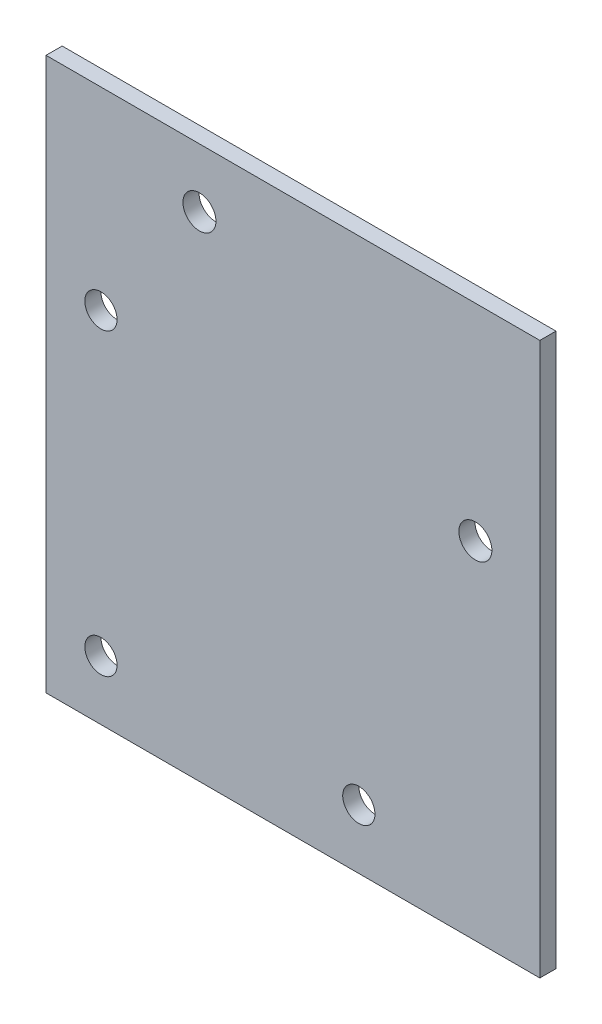
ISO-10303-21;
HEADER;
FILE_DESCRIPTION(('STEP AP214'),'2;1');
FILE_NAME('part.step','',(''),(''),'','','');
FILE_SCHEMA(('AUTOMOTIVE_DESIGN { 1 0 10303 214 1 1 1 1 }'));
ENDSEC;
DATA;
#1=APPLICATION_CONTEXT('core data for automotive mechanical design processes');
#2=APPLICATION_PROTOCOL_DEFINITION('international standard','automotive_design',2000,#1);
#3=PRODUCT_CONTEXT('',#1,'mechanical');
#4=PRODUCT('Part','Part','',(#3));
#5=PRODUCT_RELATED_PRODUCT_CATEGORY('part','',(#4));
#6=PRODUCT_DEFINITION_FORMATION('','',#4);
#7=PRODUCT_DEFINITION_CONTEXT('part definition',#1,'design');
#8=PRODUCT_DEFINITION('design','',#6,#7);
#9=PRODUCT_DEFINITION_SHAPE('','',#8);
#10=(LENGTH_UNIT() NAMED_UNIT(*) SI_UNIT(.MILLI.,.METRE.));
#11=(NAMED_UNIT(*) PLANE_ANGLE_UNIT() SI_UNIT($,.RADIAN.));
#12=(NAMED_UNIT(*) SI_UNIT($,.STERADIAN.) SOLID_ANGLE_UNIT());
#13=UNCERTAINTY_MEASURE_WITH_UNIT(LENGTH_MEASURE(1.E-05),#10,'distance_accuracy_value','');
#14=(GEOMETRIC_REPRESENTATION_CONTEXT(3) GLOBAL_UNCERTAINTY_ASSIGNED_CONTEXT((#13)) GLOBAL_UNIT_ASSIGNED_CONTEXT((#10,
#11,#12)) REPRESENTATION_CONTEXT('',''));
#15=CARTESIAN_POINT('',(0.,0.,0.));
#16=DIRECTION('',(0.,0.,1.));
#17=DIRECTION('',(1.,0.,0.));
#18=AXIS2_PLACEMENT_3D('',#15,#16,#17);
#19=CARTESIAN_POINT('',(0.,0.,3.175));
#20=DIRECTION('',(0.,0.,1.));
#21=DIRECTION('',(1.,0.,0.));
#22=AXIS2_PLACEMENT_3D('',#19,#20,#21);
#23=PLANE('',#22);
#24=CARTESIAN_POINT('',(-2.44467885683975,233.404604576393,3.175));
#25=DIRECTION('',(0.,0.,1.));
#26=DIRECTION('',(1.,0.,0.));
#27=AXIS2_PLACEMENT_3D('',#24,#25,#26);
#28=CIRCLE('',#27,3.2512);
#29=CARTESIAN_POINT('',(0.806521143160248,233.404604576393,3.175));
#30=VERTEX_POINT('',#29);
#31=EDGE_CURVE('E133',#30,#30,#28,.T.);
#32=ORIENTED_EDGE('',*,*,#31,.F.);
#33=EDGE_LOOP('',(#32));
#34=FACE_BOUND('',#33,.T.);
#35=CARTESIAN_POINT('',(-25.4000000000006,176.892857142857,3.175));
#36=DIRECTION('',(0.,0.,1.));
#37=DIRECTION('',(1.,0.,0.));
#38=AXIS2_PLACEMENT_3D('',#35,#36,#37);
#39=CIRCLE('',#38,3.17500000000001);
#40=CARTESIAN_POINT('',(-22.2250000000006,176.892857142857,3.175));
#41=VERTEX_POINT('',#40);
#42=EDGE_CURVE('E121',#41,#41,#39,.T.);
#43=ORIENTED_EDGE('',*,*,#42,.F.);
#44=EDGE_LOOP('',(#43));
#45=FACE_BOUND('',#44,.T.);
#46=DIRECTION('',(0.,1.,0.));
#47=VECTOR('',#46,1.);
#48=CARTESIAN_POINT('',(10.2553211431602,165.187480114208,3.175));
#49=LINE('',#48,#47);
#50=CARTESIAN_POINT('',(10.2553211431602,165.187480114208,3.175));
#51=VERTEX_POINT('',#50);
#52=CARTESIAN_POINT('',(10.2553211431602,273.957142857143,3.175));
#53=VERTEX_POINT('',#52);
#54=EDGE_CURVE('E91',#51,#53,#49,.T.);
#55=ORIENTED_EDGE('',*,*,#54,.T.);
#56=DIRECTION('',(-1.,0.,0.));
#57=VECTOR('',#56,1.);
#58=CARTESIAN_POINT('',(10.2553211431602,273.957142857143,3.175));
#59=LINE('',#58,#57);
#60=CARTESIAN_POINT('',(-87.0131832948946,273.957142857143,3.175));
#61=VERTEX_POINT('',#60);
#62=EDGE_CURVE('E86',#53,#61,#59,.T.);
#63=ORIENTED_EDGE('',*,*,#62,.T.);
#64=DIRECTION('',(0.,-1.,0.));
#65=VECTOR('',#64,1.);
#66=CARTESIAN_POINT('',(-87.0131832948946,165.187480114208,3.175));
#67=LINE('',#66,#65);
#68=CARTESIAN_POINT('',(-87.0131832948946,165.187480114208,3.175));
#69=VERTEX_POINT('',#68);
#70=EDGE_CURVE('E89',#61,#69,#67,.T.);
#71=ORIENTED_EDGE('',*,*,#70,.T.);
#72=DIRECTION('',(1.,0.,0.));
#73=VECTOR('',#72,1.);
#74=CARTESIAN_POINT('',(10.2553211431602,165.187480114208,3.175));
#75=LINE('',#74,#73);
#76=EDGE_CURVE('E56',#69,#51,#75,.T.);
#77=ORIENTED_EDGE('',*,*,#76,.T.);
#78=EDGE_LOOP('',(#55,#63,#71,#77));
#79=FACE_BOUND('',#78,.T.);
#80=CARTESIAN_POINT('',(-76.2000000000008,235.857142857143,3.175));
#81=DIRECTION('',(0.,0.,1.));
#82=DIRECTION('',(1.,0.,0.));
#83=AXIS2_PLACEMENT_3D('',#80,#81,#82);
#84=CIRCLE('',#83,3.17499999999998);
#85=CARTESIAN_POINT('',(-73.0250000000008,235.857142857143,3.175));
#86=VERTEX_POINT('',#85);
#87=EDGE_CURVE('E106',#86,#86,#84,.T.);
#88=ORIENTED_EDGE('',*,*,#87,.F.);
#89=EDGE_LOOP('',(#88));
#90=FACE_BOUND('',#89,.T.);
#91=CARTESIAN_POINT('',(-76.2000000000006,176.892857142857,3.175));
#92=DIRECTION('',(0.,0.,1.));
#93=DIRECTION('',(1.,0.,0.));
#94=AXIS2_PLACEMENT_3D('',#91,#92,#93);
#95=CIRCLE('',#94,3.17499999999998);
#96=CARTESIAN_POINT('',(-73.0250000000006,176.892857142857,3.175));
#97=VERTEX_POINT('',#96);
#98=EDGE_CURVE('E127',#97,#97,#95,.T.);
#99=ORIENTED_EDGE('',*,*,#98,.F.);
#100=EDGE_LOOP('',(#99));
#101=FACE_BOUND('',#100,.T.);
#102=CARTESIAN_POINT('',(-56.8006788568397,262.360604576393,3.175));
#103=DIRECTION('',(0.,0.,1.));
#104=DIRECTION('',(1.,0.,0.));
#105=AXIS2_PLACEMENT_3D('',#102,#103,#104);
#106=CIRCLE('',#105,3.2512);
#107=CARTESIAN_POINT('',(-53.5494788568397,262.360604576393,3.175));
#108=VERTEX_POINT('',#107);
#109=EDGE_CURVE('E139',#108,#108,#106,.T.);
#110=ORIENTED_EDGE('',*,*,#109,.F.);
#111=EDGE_LOOP('',(#110));
#112=FACE_BOUND('',#111,.T.);
#113=ADVANCED_FACE('F39',(#34,#45,#79,#90,#101,#112),#23,.T.);
#114=CARTESIAN_POINT('',(0.,0.,0.));
#115=DIRECTION('',(0.,0.,1.));
#116=DIRECTION('',(1.,0.,0.));
#117=AXIS2_PLACEMENT_3D('',#114,#115,#116);
#118=PLANE('',#117);
#119=DIRECTION('',(0.,1.,0.));
#120=VECTOR('',#119,1.);
#121=CARTESIAN_POINT('',(10.2553211431602,165.187480114208,0.));
#122=LINE('',#121,#120);
#123=CARTESIAN_POINT('',(10.2553211431602,165.187480114208,0.));
#124=VERTEX_POINT('',#123);
#125=CARTESIAN_POINT('',(10.2553211431602,273.957142857143,0.));
#126=VERTEX_POINT('',#125);
#127=EDGE_CURVE('E103',#124,#126,#122,.T.);
#128=ORIENTED_EDGE('',*,*,#127,.F.);
#129=DIRECTION('',(1.,0.,0.));
#130=VECTOR('',#129,1.);
#131=CARTESIAN_POINT('',(10.2553211431602,165.187480114208,0.));
#132=LINE('',#131,#130);
#133=CARTESIAN_POINT('',(-87.0131832948946,165.187480114208,0.));
#134=VERTEX_POINT('',#133);
#135=EDGE_CURVE('E79',#134,#124,#132,.T.);
#136=ORIENTED_EDGE('',*,*,#135,.F.);
#137=DIRECTION('',(0.,-1.,0.));
#138=VECTOR('',#137,1.);
#139=CARTESIAN_POINT('',(-87.0131832948946,165.187480114208,0.));
#140=LINE('',#139,#138);
#141=CARTESIAN_POINT('',(-87.0131832948946,273.957142857143,0.));
#142=VERTEX_POINT('',#141);
#143=EDGE_CURVE('E73',#142,#134,#140,.T.);
#144=ORIENTED_EDGE('',*,*,#143,.F.);
#145=DIRECTION('',(-1.,0.,0.));
#146=VECTOR('',#145,1.);
#147=CARTESIAN_POINT('',(10.2553211431602,273.957142857143,0.));
#148=LINE('',#147,#146);
#149=EDGE_CURVE('E95',#126,#142,#148,.T.);
#150=ORIENTED_EDGE('',*,*,#149,.F.);
#151=EDGE_LOOP('',(#128,#136,#144,#150));
#152=FACE_BOUND('',#151,.T.);
#153=CARTESIAN_POINT('',(-76.2000000000008,235.857142857143,0.));
#154=DIRECTION('',(0.,0.,1.));
#155=DIRECTION('',(1.,0.,0.));
#156=AXIS2_PLACEMENT_3D('',#153,#154,#155);
#157=CIRCLE('',#156,3.17499999999998);
#158=CARTESIAN_POINT('',(-73.0250000000008,235.857142857143,0.));
#159=VERTEX_POINT('',#158);
#160=EDGE_CURVE('E118',#159,#159,#157,.T.);
#161=ORIENTED_EDGE('',*,*,#160,.T.);
#162=EDGE_LOOP('',(#161));
#163=FACE_BOUND('',#162,.T.);
#164=CARTESIAN_POINT('',(-25.4000000000006,176.892857142857,0.));
#165=DIRECTION('',(0.,0.,1.));
#166=DIRECTION('',(1.,0.,0.));
#167=AXIS2_PLACEMENT_3D('',#164,#165,#166);
#168=CIRCLE('',#167,3.17500000000001);
#169=CARTESIAN_POINT('',(-22.2250000000006,176.892857142857,0.));
#170=VERTEX_POINT('',#169);
#171=EDGE_CURVE('E124',#170,#170,#168,.T.);
#172=ORIENTED_EDGE('',*,*,#171,.T.);
#173=EDGE_LOOP('',(#172));
#174=FACE_BOUND('',#173,.T.);
#175=CARTESIAN_POINT('',(-76.2000000000006,176.892857142857,0.));
#176=DIRECTION('',(0.,0.,1.));
#177=DIRECTION('',(1.,0.,0.));
#178=AXIS2_PLACEMENT_3D('',#175,#176,#177);
#179=CIRCLE('',#178,3.17499999999998);
#180=CARTESIAN_POINT('',(-73.0250000000006,176.892857142857,0.));
#181=VERTEX_POINT('',#180);
#182=EDGE_CURVE('E130',#181,#181,#179,.T.);
#183=ORIENTED_EDGE('',*,*,#182,.T.);
#184=EDGE_LOOP('',(#183));
#185=FACE_BOUND('',#184,.T.);
#186=CARTESIAN_POINT('',(-2.44467885683975,233.404604576393,0.));
#187=DIRECTION('',(0.,0.,1.));
#188=DIRECTION('',(1.,0.,0.));
#189=AXIS2_PLACEMENT_3D('',#186,#187,#188);
#190=CIRCLE('',#189,3.2512);
#191=CARTESIAN_POINT('',(0.806521143160248,233.404604576393,0.));
#192=VERTEX_POINT('',#191);
#193=EDGE_CURVE('E136',#192,#192,#190,.T.);
#194=ORIENTED_EDGE('',*,*,#193,.T.);
#195=EDGE_LOOP('',(#194));
#196=FACE_BOUND('',#195,.T.);
#197=CARTESIAN_POINT('',(-56.8006788568397,262.360604576393,0.));
#198=DIRECTION('',(0.,0.,1.));
#199=DIRECTION('',(1.,0.,0.));
#200=AXIS2_PLACEMENT_3D('',#197,#198,#199);
#201=CIRCLE('',#200,3.2512);
#202=CARTESIAN_POINT('',(-53.5494788568397,262.360604576393,0.));
#203=VERTEX_POINT('',#202);
#204=EDGE_CURVE('E142',#203,#203,#201,.T.);
#205=ORIENTED_EDGE('',*,*,#204,.T.);
#206=EDGE_LOOP('',(#205));
#207=FACE_BOUND('',#206,.T.);
#208=ADVANCED_FACE('F114',(#152,#163,#174,#185,#196,#207),#118,.F.);
#209=CARTESIAN_POINT('',(10.2553211431602,165.187480114208,3.175));
#210=DIRECTION('',(-1.,0.,0.));
#211=DIRECTION('',(0.,-1.,0.));
#212=AXIS2_PLACEMENT_3D('',#209,#210,#211);
#213=PLANE('',#212);
#214=ORIENTED_EDGE('',*,*,#127,.T.);
#215=DIRECTION('',(0.,0.,-1.));
#216=VECTOR('',#215,1.);
#217=CARTESIAN_POINT('',(10.2553211431602,273.957142857143,3.175));
#218=LINE('',#217,#216);
#219=EDGE_CURVE('E11',#53,#126,#218,.T.);
#220=ORIENTED_EDGE('',*,*,#219,.F.);
#221=ORIENTED_EDGE('',*,*,#54,.F.);
#222=DIRECTION('',(0.,0.,-1.));
#223=VECTOR('',#222,1.);
#224=CARTESIAN_POINT('',(10.2553211431602,165.187480114208,3.175));
#225=LINE('',#224,#223);
#226=EDGE_CURVE('E99',#51,#124,#225,.T.);
#227=ORIENTED_EDGE('',*,*,#226,.T.);
#228=EDGE_LOOP('',(#214,#220,#221,#227));
#229=FACE_BOUND('',#228,.T.);
#230=ADVANCED_FACE('F41',(#229),#213,.F.);
#231=CARTESIAN_POINT('',(10.2553211431602,273.957142857143,3.175));
#232=DIRECTION('',(0.,-1.,0.));
#233=DIRECTION('',(0.,0.,-1.));
#234=AXIS2_PLACEMENT_3D('',#231,#232,#233);
#235=PLANE('',#234);
#236=ORIENTED_EDGE('',*,*,#149,.T.);
#237=DIRECTION('',(0.,0.,-1.));
#238=VECTOR('',#237,1.);
#239=CARTESIAN_POINT('',(-87.0131832948946,273.957142857143,3.175));
#240=LINE('',#239,#238);
#241=EDGE_CURVE('E48',#61,#142,#240,.T.);
#242=ORIENTED_EDGE('',*,*,#241,.F.);
#243=ORIENTED_EDGE('',*,*,#62,.F.);
#244=ORIENTED_EDGE('',*,*,#219,.T.);
#245=EDGE_LOOP('',(#236,#242,#243,#244));
#246=FACE_BOUND('',#245,.T.);
#247=ADVANCED_FACE('F94',(#246),#235,.F.);
#248=CARTESIAN_POINT('',(-87.0131832948946,165.187480114208,3.175));
#249=DIRECTION('',(1.,0.,0.));
#250=DIRECTION('',(0.,0.,-1.));
#251=AXIS2_PLACEMENT_3D('',#248,#249,#250);
#252=PLANE('',#251);
#253=ORIENTED_EDGE('',*,*,#143,.T.);
#254=DIRECTION('',(0.,0.,-1.));
#255=VECTOR('',#254,1.);
#256=CARTESIAN_POINT('',(-87.0131832948946,165.187480114208,3.175));
#257=LINE('',#256,#255);
#258=EDGE_CURVE('E96',#69,#134,#257,.T.);
#259=ORIENTED_EDGE('',*,*,#258,.F.);
#260=ORIENTED_EDGE('',*,*,#70,.F.);
#261=ORIENTED_EDGE('',*,*,#241,.T.);
#262=EDGE_LOOP('',(#253,#259,#260,#261));
#263=FACE_BOUND('',#262,.T.);
#264=ADVANCED_FACE('F97',(#263),#252,.F.);
#265=CARTESIAN_POINT('',(10.2553211431602,165.187480114208,3.175));
#266=DIRECTION('',(0.,1.,0.));
#267=DIRECTION('',(-1.,0.,0.));
#268=AXIS2_PLACEMENT_3D('',#265,#266,#267);
#269=PLANE('',#268);
#270=ORIENTED_EDGE('',*,*,#135,.T.);
#271=ORIENTED_EDGE('',*,*,#226,.F.);
#272=ORIENTED_EDGE('',*,*,#76,.F.);
#273=ORIENTED_EDGE('',*,*,#258,.T.);
#274=EDGE_LOOP('',(#270,#271,#272,#273));
#275=FACE_BOUND('',#274,.T.);
#276=ADVANCED_FACE('F111',(#275),#269,.F.);
#277=CARTESIAN_POINT('',(-76.2000000000008,235.857142857143,3.175));
#278=DIRECTION('',(0.,0.,-1.));
#279=DIRECTION('',(-1.,0.,0.));
#280=AXIS2_PLACEMENT_3D('',#277,#278,#279);
#281=CYLINDRICAL_SURFACE('',#280,3.17499999999998);
#282=ORIENTED_EDGE('',*,*,#87,.T.);
#283=EDGE_LOOP('',(#282));
#284=FACE_BOUND('',#283,.T.);
#285=ORIENTED_EDGE('',*,*,#160,.F.);
#286=EDGE_LOOP('',(#285));
#287=FACE_BOUND('',#286,.T.);
#288=ADVANCED_FACE('F161',(#284,#287),#281,.F.);
#289=CARTESIAN_POINT('',(-25.4000000000006,176.892857142857,3.175));
#290=DIRECTION('',(0.,0.,-1.));
#291=DIRECTION('',(-1.,0.,0.));
#292=AXIS2_PLACEMENT_3D('',#289,#290,#291);
#293=CYLINDRICAL_SURFACE('',#292,3.17500000000001);
#294=ORIENTED_EDGE('',*,*,#42,.T.);
#295=EDGE_LOOP('',(#294));
#296=FACE_BOUND('',#295,.T.);
#297=ORIENTED_EDGE('',*,*,#171,.F.);
#298=EDGE_LOOP('',(#297));
#299=FACE_BOUND('',#298,.T.);
#300=ADVANCED_FACE('F206',(#296,#299),#293,.F.);
#301=CARTESIAN_POINT('',(-76.2000000000006,176.892857142857,3.175));
#302=DIRECTION('',(0.,0.,-1.));
#303=DIRECTION('',(-1.,0.,0.));
#304=AXIS2_PLACEMENT_3D('',#301,#302,#303);
#305=CYLINDRICAL_SURFACE('',#304,3.17499999999998);
#306=ORIENTED_EDGE('',*,*,#98,.T.);
#307=EDGE_LOOP('',(#306));
#308=FACE_BOUND('',#307,.T.);
#309=ORIENTED_EDGE('',*,*,#182,.F.);
#310=EDGE_LOOP('',(#309));
#311=FACE_BOUND('',#310,.T.);
#312=ADVANCED_FACE('F214',(#308,#311),#305,.F.);
#313=CARTESIAN_POINT('',(-2.44467885683975,233.404604576393,3.175));
#314=DIRECTION('',(0.,0.,-1.));
#315=DIRECTION('',(-1.,0.,0.));
#316=AXIS2_PLACEMENT_3D('',#313,#314,#315);
#317=CYLINDRICAL_SURFACE('',#316,3.2512);
#318=ORIENTED_EDGE('',*,*,#31,.T.);
#319=EDGE_LOOP('',(#318));
#320=FACE_BOUND('',#319,.T.);
#321=ORIENTED_EDGE('',*,*,#193,.F.);
#322=EDGE_LOOP('',(#321));
#323=FACE_BOUND('',#322,.T.);
#324=ADVANCED_FACE('F222',(#320,#323),#317,.F.);
#325=CARTESIAN_POINT('',(-56.8006788568397,262.360604576393,3.175));
#326=DIRECTION('',(0.,0.,-1.));
#327=DIRECTION('',(-1.,0.,0.));
#328=AXIS2_PLACEMENT_3D('',#325,#326,#327);
#329=CYLINDRICAL_SURFACE('',#328,3.2512);
#330=ORIENTED_EDGE('',*,*,#109,.T.);
#331=EDGE_LOOP('',(#330));
#332=FACE_BOUND('',#331,.T.);
#333=ORIENTED_EDGE('',*,*,#204,.F.);
#334=EDGE_LOOP('',(#333));
#335=FACE_BOUND('',#334,.T.);
#336=ADVANCED_FACE('F148',(#332,#335),#329,.F.);
#337=CLOSED_SHELL('',(#113,#208,#230,#247,#264,#276,#288,#300,#312,#324,#336));
#338=MANIFOLD_SOLID_BREP('B2',#337);
#339=ADVANCED_BREP_SHAPE_REPRESENTATION('',(#18,#338),#14);
#340=SHAPE_DEFINITION_REPRESENTATION(#9,#339);
ENDSEC;
END-ISO-10303-21;
